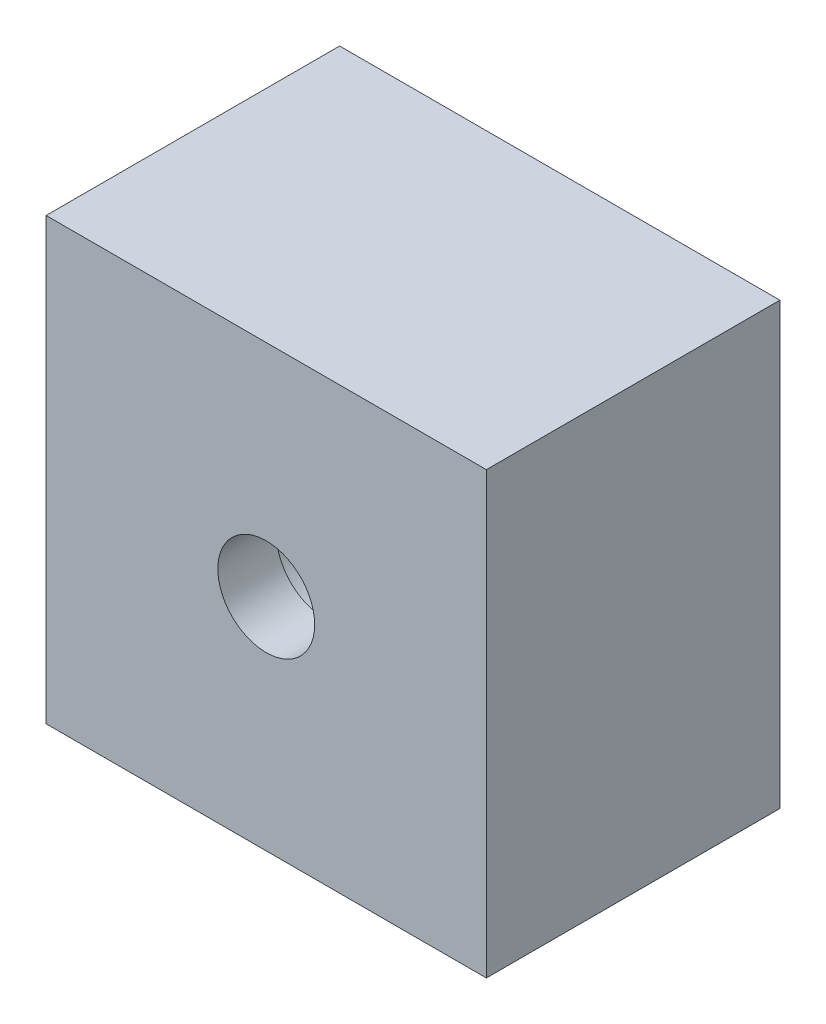
ISO-10303-21;
HEADER;
FILE_DESCRIPTION(('STEP AP214'),'2;1');
FILE_NAME('part.step','',(''),(''),'','','');
FILE_SCHEMA(('AUTOMOTIVE_DESIGN { 1 0 10303 214 1 1 1 1 }'));
ENDSEC;
DATA;
#1=APPLICATION_CONTEXT('core data for automotive mechanical design processes');
#2=APPLICATION_PROTOCOL_DEFINITION('international standard','automotive_design',2000,#1);
#3=PRODUCT_CONTEXT('',#1,'mechanical');
#4=PRODUCT('Part','Part','',(#3));
#5=PRODUCT_RELATED_PRODUCT_CATEGORY('part','',(#4));
#6=PRODUCT_DEFINITION_FORMATION('','',#4);
#7=PRODUCT_DEFINITION_CONTEXT('part definition',#1,'design');
#8=PRODUCT_DEFINITION('design','',#6,#7);
#9=PRODUCT_DEFINITION_SHAPE('','',#8);
#10=(LENGTH_UNIT() NAMED_UNIT(*) SI_UNIT(.MILLI.,.METRE.));
#11=(NAMED_UNIT(*) PLANE_ANGLE_UNIT() SI_UNIT($,.RADIAN.));
#12=(NAMED_UNIT(*) SI_UNIT($,.STERADIAN.) SOLID_ANGLE_UNIT());
#13=UNCERTAINTY_MEASURE_WITH_UNIT(LENGTH_MEASURE(1.E-05),#10,'distance_accuracy_value','');
#14=(GEOMETRIC_REPRESENTATION_CONTEXT(3) GLOBAL_UNCERTAINTY_ASSIGNED_CONTEXT((#13)) GLOBAL_UNIT_ASSIGNED_CONTEXT((#10,
#11,#12)) REPRESENTATION_CONTEXT('',''));
#15=CARTESIAN_POINT('',(0.,0.,0.));
#16=DIRECTION('',(0.,0.,1.));
#17=DIRECTION('',(1.,0.,0.));
#18=AXIS2_PLACEMENT_3D('',#15,#16,#17);
#19=CARTESIAN_POINT('',(0.,0.,0.));
#20=DIRECTION('',(0.,0.,1.));
#21=DIRECTION('',(1.,0.,0.));
#22=AXIS2_PLACEMENT_3D('',#19,#20,#21);
#23=PLANE('',#22);
#24=DIRECTION('',(-1.,0.,0.));
#25=VECTOR('',#24,1.);
#26=CARTESIAN_POINT('',(0.,7.5,0.));
#27=LINE('',#26,#25);
#28=CARTESIAN_POINT('',(7.5,7.5,0.));
#29=VERTEX_POINT('',#28);
#30=CARTESIAN_POINT('',(-7.5,7.5,0.));
#31=VERTEX_POINT('',#30);
#32=EDGE_CURVE('E103',#29,#31,#27,.T.);
#33=ORIENTED_EDGE('',*,*,#32,.F.);
#34=DIRECTION('',(0.,-1.,0.));
#35=VECTOR('',#34,1.);
#36=CARTESIAN_POINT('',(7.5,0.,0.));
#37=LINE('',#36,#35);
#38=CARTESIAN_POINT('',(7.50000000000001,-7.5,0.));
#39=VERTEX_POINT('',#38);
#40=EDGE_CURVE('E109',#29,#39,#37,.T.);
#41=ORIENTED_EDGE('',*,*,#40,.T.);
#42=DIRECTION('',(-1.,0.,0.));
#43=VECTOR('',#42,1.);
#44=CARTESIAN_POINT('',(0.,-7.5,0.));
#45=LINE('',#44,#43);
#46=CARTESIAN_POINT('',(-7.49999999999999,-7.5,0.));
#47=VERTEX_POINT('',#46);
#48=EDGE_CURVE('E107',#39,#47,#45,.T.);
#49=ORIENTED_EDGE('',*,*,#48,.T.);
#50=DIRECTION('',(0.,-1.,0.));
#51=VECTOR('',#50,1.);
#52=CARTESIAN_POINT('',(-7.49999999999999,0.,0.));
#53=LINE('',#52,#51);
#54=EDGE_CURVE('E91',#31,#47,#53,.T.);
#55=ORIENTED_EDGE('',*,*,#54,.F.);
#56=EDGE_LOOP('',(#33,#41,#49,#55));
#57=FACE_BOUND('',#56,.T.);
#58=CARTESIAN_POINT('',(0.,0.,0.));
#59=DIRECTION('',(0.,0.,1.));
#60=DIRECTION('',(1.,0.,0.));
#61=AXIS2_PLACEMENT_3D('',#58,#59,#60);
#62=CIRCLE('',#61,2.45);
#63=CARTESIAN_POINT('',(2.45,0.,0.));
#64=VERTEX_POINT('',#63);
#65=EDGE_CURVE('E115',#64,#64,#62,.T.);
#66=ORIENTED_EDGE('',*,*,#65,.T.);
#67=EDGE_LOOP('',(#66));
#68=FACE_BOUND('',#67,.T.);
#69=ADVANCED_FACE('F35',(#57,#68),#23,.F.);
#70=CARTESIAN_POINT('',(0.,7.5,10.));
#71=DIRECTION('',(0.,-1.,0.));
#72=DIRECTION('',(0.,0.,-1.));
#73=AXIS2_PLACEMENT_3D('',#70,#71,#72);
#74=PLANE('',#73);
#75=ORIENTED_EDGE('',*,*,#32,.T.);
#76=DIRECTION('',(0.,0.,-1.));
#77=VECTOR('',#76,1.);
#78=CARTESIAN_POINT('',(-7.5,7.5,10.));
#79=LINE('',#78,#77);
#80=CARTESIAN_POINT('',(-7.5,7.5,10.));
#81=VERTEX_POINT('',#80);
#82=EDGE_CURVE('E11',#81,#31,#79,.T.);
#83=ORIENTED_EDGE('',*,*,#82,.F.);
#84=DIRECTION('',(-1.,0.,0.));
#85=VECTOR('',#84,1.);
#86=CARTESIAN_POINT('',(0.,7.5,10.));
#87=LINE('',#86,#85);
#88=CARTESIAN_POINT('',(7.5,7.5,10.));
#89=VERTEX_POINT('',#88);
#90=EDGE_CURVE('E86',#89,#81,#87,.T.);
#91=ORIENTED_EDGE('',*,*,#90,.F.);
#92=DIRECTION('',(0.,0.,-1.));
#93=VECTOR('',#92,1.);
#94=CARTESIAN_POINT('',(7.5,7.5,10.));
#95=LINE('',#94,#93);
#96=EDGE_CURVE('E52',#89,#29,#95,.T.);
#97=ORIENTED_EDGE('',*,*,#96,.T.);
#98=EDGE_LOOP('',(#75,#83,#91,#97));
#99=FACE_BOUND('',#98,.T.);
#100=ADVANCED_FACE('F37',(#99),#74,.F.);
#101=CARTESIAN_POINT('',(-7.49999999999999,0.,10.));
#102=DIRECTION('',(1.,0.,0.));
#103=DIRECTION('',(0.,1.,0.));
#104=AXIS2_PLACEMENT_3D('',#101,#102,#103);
#105=PLANE('',#104);
#106=ORIENTED_EDGE('',*,*,#54,.T.);
#107=DIRECTION('',(0.,0.,-1.));
#108=VECTOR('',#107,1.);
#109=CARTESIAN_POINT('',(-7.49999999999999,-7.5,10.));
#110=LINE('',#109,#108);
#111=CARTESIAN_POINT('',(-7.49999999999999,-7.5,10.));
#112=VERTEX_POINT('',#111);
#113=EDGE_CURVE('E44',#112,#47,#110,.T.);
#114=ORIENTED_EDGE('',*,*,#113,.F.);
#115=DIRECTION('',(0.,-1.,0.));
#116=VECTOR('',#115,1.);
#117=CARTESIAN_POINT('',(-7.49999999999999,0.,10.));
#118=LINE('',#117,#116);
#119=EDGE_CURVE('E77',#81,#112,#118,.T.);
#120=ORIENTED_EDGE('',*,*,#119,.F.);
#121=ORIENTED_EDGE('',*,*,#82,.T.);
#122=EDGE_LOOP('',(#106,#114,#120,#121));
#123=FACE_BOUND('',#122,.T.);
#124=ADVANCED_FACE('F90',(#123),#105,.F.);
#125=CARTESIAN_POINT('',(0.,-7.5,10.));
#126=DIRECTION('',(0.,-1.,0.));
#127=DIRECTION('',(0.,0.,-1.));
#128=AXIS2_PLACEMENT_3D('',#125,#126,#127);
#129=PLANE('',#128);
#130=ORIENTED_EDGE('',*,*,#48,.F.);
#131=DIRECTION('',(0.,0.,-1.));
#132=VECTOR('',#131,1.);
#133=CARTESIAN_POINT('',(7.50000000000001,-7.5,10.));
#134=LINE('',#133,#132);
#135=CARTESIAN_POINT('',(7.50000000000001,-7.5,10.));
#136=VERTEX_POINT('',#135);
#137=EDGE_CURVE('E66',#136,#39,#134,.T.);
#138=ORIENTED_EDGE('',*,*,#137,.F.);
#139=DIRECTION('',(-1.,0.,0.));
#140=VECTOR('',#139,1.);
#141=CARTESIAN_POINT('',(0.,-7.5,10.));
#142=LINE('',#141,#140);
#143=EDGE_CURVE('E85',#136,#112,#142,.T.);
#144=ORIENTED_EDGE('',*,*,#143,.T.);
#145=ORIENTED_EDGE('',*,*,#113,.T.);
#146=EDGE_LOOP('',(#130,#138,#144,#145));
#147=FACE_BOUND('',#146,.T.);
#148=ADVANCED_FACE('F94',(#147),#129,.T.);
#149=CARTESIAN_POINT('',(7.5,0.,10.));
#150=DIRECTION('',(1.,0.,0.));
#151=DIRECTION('',(0.,1.,0.));
#152=AXIS2_PLACEMENT_3D('',#149,#150,#151);
#153=PLANE('',#152);
#154=ORIENTED_EDGE('',*,*,#40,.F.);
#155=ORIENTED_EDGE('',*,*,#96,.F.);
#156=DIRECTION('',(0.,-1.,0.));
#157=VECTOR('',#156,1.);
#158=CARTESIAN_POINT('',(7.5,0.,10.));
#159=LINE('',#158,#157);
#160=EDGE_CURVE('E95',#89,#136,#159,.T.);
#161=ORIENTED_EDGE('',*,*,#160,.T.);
#162=ORIENTED_EDGE('',*,*,#137,.T.);
#163=EDGE_LOOP('',(#154,#155,#161,#162));
#164=FACE_BOUND('',#163,.T.);
#165=ADVANCED_FACE('F130',(#164),#153,.T.);
#166=CARTESIAN_POINT('',(0.,0.,10.));
#167=DIRECTION('',(0.,0.,-1.));
#168=DIRECTION('',(-1.,0.,0.));
#169=AXIS2_PLACEMENT_3D('',#166,#167,#168);
#170=CYLINDRICAL_SURFACE('',#169,1.65);
#171=CARTESIAN_POINT('',(0.,0.,8.));
#172=DIRECTION('',(0.,0.,1.));
#173=DIRECTION('',(1.,0.,0.));
#174=AXIS2_PLACEMENT_3D('',#171,#172,#173);
#175=CIRCLE('',#174,1.65);
#176=CARTESIAN_POINT('',(1.65,0.,8.));
#177=VERTEX_POINT('',#176);
#178=EDGE_CURVE('E118',#177,#177,#175,.T.);
#179=ORIENTED_EDGE('',*,*,#178,.F.);
#180=EDGE_LOOP('',(#179));
#181=FACE_BOUND('',#180,.T.);
#182=CARTESIAN_POINT('',(0.,0.,10.));
#183=DIRECTION('',(0.,0.,1.));
#184=DIRECTION('',(1.,0.,0.));
#185=AXIS2_PLACEMENT_3D('',#182,#183,#184);
#186=CIRCLE('',#185,1.65);
#187=CARTESIAN_POINT('',(1.65,0.,10.));
#188=VERTEX_POINT('',#187);
#189=EDGE_CURVE('E97',#188,#188,#186,.T.);
#190=ORIENTED_EDGE('',*,*,#189,.T.);
#191=EDGE_LOOP('',(#190));
#192=FACE_BOUND('',#191,.T.);
#193=ADVANCED_FACE('F127',(#181,#192),#170,.F.);
#194=CARTESIAN_POINT('',(0.,0.,10.));
#195=DIRECTION('',(0.,0.,1.));
#196=DIRECTION('',(1.,0.,0.));
#197=AXIS2_PLACEMENT_3D('',#194,#195,#196);
#198=PLANE('',#197);
#199=ORIENTED_EDGE('',*,*,#90,.T.);
#200=ORIENTED_EDGE('',*,*,#119,.T.);
#201=ORIENTED_EDGE('',*,*,#143,.F.);
#202=ORIENTED_EDGE('',*,*,#160,.F.);
#203=EDGE_LOOP('',(#199,#200,#201,#202));
#204=FACE_BOUND('',#203,.T.);
#205=ORIENTED_EDGE('',*,*,#189,.F.);
#206=EDGE_LOOP('',(#205));
#207=FACE_BOUND('',#206,.T.);
#208=ADVANCED_FACE('F81',(#204,#207),#198,.T.);
#209=CARTESIAN_POINT('',(0.,0.,8.));
#210=DIRECTION('',(0.,0.,-1.));
#211=DIRECTION('',(-1.,0.,0.));
#212=AXIS2_PLACEMENT_3D('',#209,#210,#211);
#213=CYLINDRICAL_SURFACE('',#212,2.45);
#214=CARTESIAN_POINT('',(0.,0.,8.));
#215=DIRECTION('',(0.,0.,1.));
#216=DIRECTION('',(1.,0.,0.));
#217=AXIS2_PLACEMENT_3D('',#214,#215,#216);
#218=CIRCLE('',#217,2.45);
#219=CARTESIAN_POINT('',(2.45,0.,8.));
#220=VERTEX_POINT('',#219);
#221=EDGE_CURVE('E105',#220,#220,#218,.T.);
#222=ORIENTED_EDGE('',*,*,#221,.T.);
#223=EDGE_LOOP('',(#222));
#224=FACE_BOUND('',#223,.T.);
#225=ORIENTED_EDGE('',*,*,#65,.F.);
#226=EDGE_LOOP('',(#225));
#227=FACE_BOUND('',#226,.T.);
#228=ADVANCED_FACE('F134',(#224,#227),#213,.F.);
#229=CARTESIAN_POINT('',(0.,0.,8.));
#230=DIRECTION('',(0.,0.,1.));
#231=DIRECTION('',(1.,0.,0.));
#232=AXIS2_PLACEMENT_3D('',#229,#230,#231);
#233=PLANE('',#232);
#234=ORIENTED_EDGE('',*,*,#178,.T.);
#235=EDGE_LOOP('',(#234));
#236=FACE_BOUND('',#235,.T.);
#237=ORIENTED_EDGE('',*,*,#221,.F.);
#238=EDGE_LOOP('',(#237));
#239=FACE_BOUND('',#238,.T.);
#240=ADVANCED_FACE('F124',(#236,#239),#233,.F.);
#241=CLOSED_SHELL('',(#69,#100,#124,#148,#165,#193,#208,#228,#240));
#242=MANIFOLD_SOLID_BREP('B2',#241);
#243=ADVANCED_BREP_SHAPE_REPRESENTATION('',(#18,#242),#14);
#244=SHAPE_DEFINITION_REPRESENTATION(#9,#243);
ENDSEC;
END-ISO-10303-21;
